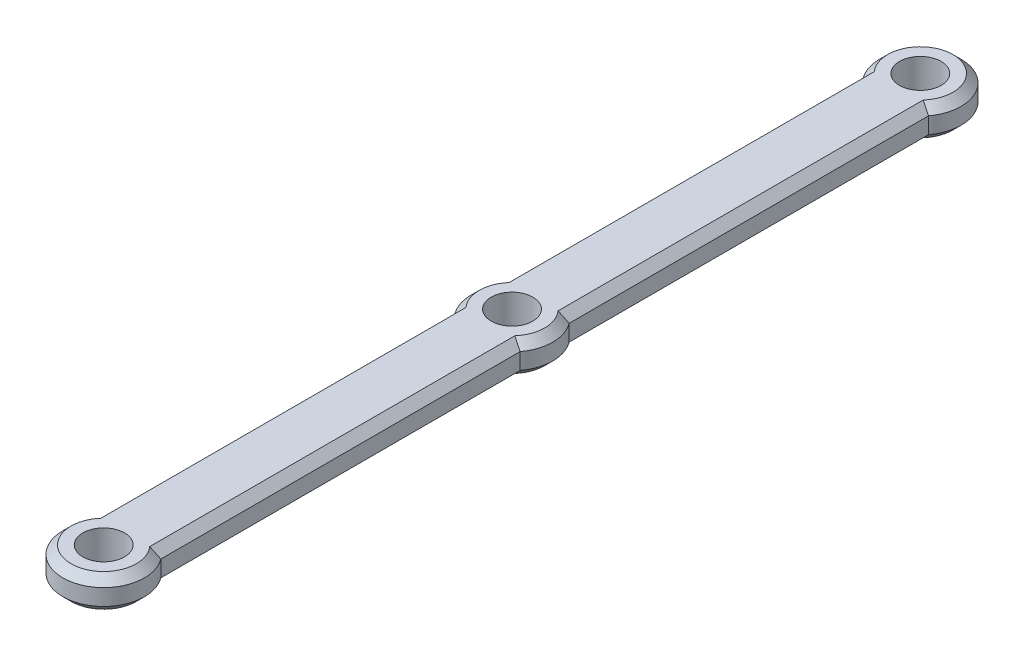
ISO-10303-21;
HEADER;
FILE_DESCRIPTION(('STEP AP214'),'2;1');
FILE_NAME('part.step','',(''),(''),'','','');
FILE_SCHEMA(('AUTOMOTIVE_DESIGN { 1 0 10303 214 1 1 1 1 }'));
ENDSEC;
DATA;
#1=APPLICATION_CONTEXT('core data for automotive mechanical design processes');
#2=APPLICATION_PROTOCOL_DEFINITION('international standard','automotive_design',2000,#1);
#3=PRODUCT_CONTEXT('',#1,'mechanical');
#4=PRODUCT('Part','Part','',(#3));
#5=PRODUCT_RELATED_PRODUCT_CATEGORY('part','',(#4));
#6=PRODUCT_DEFINITION_FORMATION('','',#4);
#7=PRODUCT_DEFINITION_CONTEXT('part definition',#1,'design');
#8=PRODUCT_DEFINITION('design','',#6,#7);
#9=PRODUCT_DEFINITION_SHAPE('','',#8);
#10=(LENGTH_UNIT() NAMED_UNIT(*) SI_UNIT(.MILLI.,.METRE.));
#11=(NAMED_UNIT(*) PLANE_ANGLE_UNIT() SI_UNIT($,.RADIAN.));
#12=(NAMED_UNIT(*) SI_UNIT($,.STERADIAN.) SOLID_ANGLE_UNIT());
#13=UNCERTAINTY_MEASURE_WITH_UNIT(LENGTH_MEASURE(1.E-05),#10,'distance_accuracy_value','');
#14=(GEOMETRIC_REPRESENTATION_CONTEXT(3) GLOBAL_UNCERTAINTY_ASSIGNED_CONTEXT((#13)) GLOBAL_UNIT_ASSIGNED_CONTEXT((#10,
#11,#12)) REPRESENTATION_CONTEXT('',''));
#15=CARTESIAN_POINT('',(0.,0.,0.));
#16=DIRECTION('',(0.,0.,1.));
#17=DIRECTION('',(1.,0.,0.));
#18=AXIS2_PLACEMENT_3D('',#15,#16,#17);
#19=CARTESIAN_POINT('',(0.,4.,0.));
#20=DIRECTION('',(0.,-1.,0.));
#21=DIRECTION('',(0.,0.,-1.));
#22=AXIS2_PLACEMENT_3D('',#19,#20,#21);
#23=CYLINDRICAL_SURFACE('',#22,5.);
#24=DIRECTION('',(0.,-1.,0.));
#25=VECTOR('',#24,1.);
#26=CARTESIAN_POINT('',(-4.,4.,-3.));
#27=LINE('',#26,#25);
#28=CARTESIAN_POINT('',(-4.,3.,-3.));
#29=VERTEX_POINT('',#28);
#30=CARTESIAN_POINT('',(-4.,0.999999999999987,-3.));
#31=VERTEX_POINT('',#30);
#32=EDGE_CURVE('E505',#29,#31,#27,.T.);
#33=ORIENTED_EDGE('',*,*,#32,.T.);
#34=CARTESIAN_POINT('',(0.,0.999999999999987,0.));
#35=DIRECTION('',(0.,1.,0.));
#36=DIRECTION('',(0.,0.,1.));
#37=AXIS2_PLACEMENT_3D('',#34,#35,#36);
#38=CIRCLE('',#37,5.);
#39=CARTESIAN_POINT('',(-4.,0.999999999999987,3.));
#40=VERTEX_POINT('',#39);
#41=EDGE_CURVE('E316',#31,#40,#38,.T.);
#42=ORIENTED_EDGE('',*,*,#41,.T.);
#43=DIRECTION('',(0.,-1.,0.));
#44=VECTOR('',#43,1.);
#45=CARTESIAN_POINT('',(-4.,4.,3.));
#46=LINE('',#45,#44);
#47=CARTESIAN_POINT('',(-4.,3.,3.));
#48=VERTEX_POINT('',#47);
#49=EDGE_CURVE('E193',#48,#40,#46,.T.);
#50=ORIENTED_EDGE('',*,*,#49,.F.);
#51=CARTESIAN_POINT('',(0.,3.,0.));
#52=DIRECTION('',(0.,1.,0.));
#53=DIRECTION('',(0.,0.,1.));
#54=AXIS2_PLACEMENT_3D('',#51,#52,#53);
#55=CIRCLE('',#54,5.);
#56=EDGE_CURVE('E310',#48,#29,#55,.F.);
#57=ORIENTED_EDGE('',*,*,#56,.T.);
#58=EDGE_LOOP('',(#33,#42,#50,#57));
#59=FACE_BOUND('',#58,.T.);
#60=ADVANCED_FACE('F41',(#59),#23,.T.);
#61=CARTESIAN_POINT('',(-4.,4.,3.));
#62=DIRECTION('',(1.,0.,0.));
#63=DIRECTION('',(0.,0.,-1.));
#64=AXIS2_PLACEMENT_3D('',#61,#62,#63);
#65=PLANE('',#64);
#66=ORIENTED_EDGE('',*,*,#49,.T.);
#67=DIRECTION('',(0.,0.,1.));
#68=VECTOR('',#67,1.);
#69=CARTESIAN_POINT('',(-4.,0.999999999999987,3.));
#70=LINE('',#69,#68);
#71=CARTESIAN_POINT('',(-4.00000000000001,0.999999999999987,47.));
#72=VERTEX_POINT('',#71);
#73=EDGE_CURVE('E307',#40,#72,#70,.T.);
#74=ORIENTED_EDGE('',*,*,#73,.T.);
#75=DIRECTION('',(0.,-1.,0.));
#76=VECTOR('',#75,1.);
#77=CARTESIAN_POINT('',(-4.00000000000001,4.,47.));
#78=LINE('',#77,#76);
#79=CARTESIAN_POINT('',(-4.00000000000001,3.,47.));
#80=VERTEX_POINT('',#79);
#81=EDGE_CURVE('E515',#80,#72,#78,.T.);
#82=ORIENTED_EDGE('',*,*,#81,.F.);
#83=DIRECTION('',(0.,0.,-1.));
#84=VECTOR('',#83,1.);
#85=CARTESIAN_POINT('',(-4.,3.,3.));
#86=LINE('',#85,#84);
#87=EDGE_CURVE('E301',#80,#48,#86,.T.);
#88=ORIENTED_EDGE('',*,*,#87,.T.);
#89=EDGE_LOOP('',(#66,#74,#82,#88));
#90=FACE_BOUND('',#89,.T.);
#91=ADVANCED_FACE('F440',(#90),#65,.F.);
#92=CARTESIAN_POINT('',(0.,4.,50.));
#93=DIRECTION('',(0.,-1.,0.));
#94=DIRECTION('',(0.,0.,-1.));
#95=AXIS2_PLACEMENT_3D('',#92,#93,#94);
#96=CYLINDRICAL_SURFACE('',#95,5.);
#97=ORIENTED_EDGE('',*,*,#81,.T.);
#98=CARTESIAN_POINT('',(0.,0.999999999999987,50.));
#99=DIRECTION('',(0.,1.,0.));
#100=DIRECTION('',(0.,0.,1.));
#101=AXIS2_PLACEMENT_3D('',#98,#99,#100);
#102=CIRCLE('',#101,5.);
#103=CARTESIAN_POINT('',(4.00000000000001,0.999999999999987,47.));
#104=VERTEX_POINT('',#103);
#105=EDGE_CURVE('E308',#72,#104,#102,.T.);
#106=ORIENTED_EDGE('',*,*,#105,.T.);
#107=DIRECTION('',(0.,-1.,0.));
#108=VECTOR('',#107,1.);
#109=CARTESIAN_POINT('',(4.00000000000001,4.,47.));
#110=LINE('',#109,#108);
#111=CARTESIAN_POINT('',(4.00000000000001,3.,47.));
#112=VERTEX_POINT('',#111);
#113=EDGE_CURVE('E512',#112,#104,#110,.T.);
#114=ORIENTED_EDGE('',*,*,#113,.F.);
#115=CARTESIAN_POINT('',(0.,3.,50.));
#116=DIRECTION('',(0.,1.,0.));
#117=DIRECTION('',(0.,0.,1.));
#118=AXIS2_PLACEMENT_3D('',#115,#116,#117);
#119=CIRCLE('',#118,5.);
#120=EDGE_CURVE('E295',#112,#80,#119,.F.);
#121=ORIENTED_EDGE('',*,*,#120,.T.);
#122=EDGE_LOOP('',(#97,#106,#114,#121));
#123=FACE_BOUND('',#122,.T.);
#124=ADVANCED_FACE('F445',(#123),#96,.T.);
#125=CARTESIAN_POINT('',(4.,4.,2.99999999999999));
#126=DIRECTION('',(-1.,0.,0.));
#127=DIRECTION('',(0.,0.,1.));
#128=AXIS2_PLACEMENT_3D('',#125,#126,#127);
#129=PLANE('',#128);
#130=ORIENTED_EDGE('',*,*,#113,.T.);
#131=DIRECTION('',(0.,0.,-1.));
#132=VECTOR('',#131,1.);
#133=CARTESIAN_POINT('',(4.,0.999999999999987,2.99999999999999));
#134=LINE('',#133,#132);
#135=CARTESIAN_POINT('',(4.,0.999999999999987,2.99999999999999));
#136=VERTEX_POINT('',#135);
#137=EDGE_CURVE('E539',#104,#136,#134,.T.);
#138=ORIENTED_EDGE('',*,*,#137,.T.);
#139=DIRECTION('',(0.,-1.,0.));
#140=VECTOR('',#139,1.);
#141=CARTESIAN_POINT('',(4.,4.,2.99999999999999));
#142=LINE('',#141,#140);
#143=CARTESIAN_POINT('',(4.,3.,2.99999999999999));
#144=VERTEX_POINT('',#143);
#145=EDGE_CURVE('E184',#144,#136,#142,.T.);
#146=ORIENTED_EDGE('',*,*,#145,.F.);
#147=DIRECTION('',(0.,0.,1.));
#148=VECTOR('',#147,1.);
#149=CARTESIAN_POINT('',(4.00000000000001,3.,47.));
#150=LINE('',#149,#148);
#151=EDGE_CURVE('E537',#144,#112,#150,.T.);
#152=ORIENTED_EDGE('',*,*,#151,.T.);
#153=EDGE_LOOP('',(#130,#138,#146,#152));
#154=FACE_BOUND('',#153,.T.);
#155=ADVANCED_FACE('F451',(#154),#129,.F.);
#156=CARTESIAN_POINT('',(0.,4.,0.));
#157=DIRECTION('',(0.,-1.,0.));
#158=DIRECTION('',(0.,0.,-1.));
#159=AXIS2_PLACEMENT_3D('',#156,#157,#158);
#160=CYLINDRICAL_SURFACE('',#159,5.);
#161=ORIENTED_EDGE('',*,*,#145,.T.);
#162=CARTESIAN_POINT('',(0.,0.999999999999987,0.));
#163=DIRECTION('',(0.,1.,0.));
#164=DIRECTION('',(0.,0.,1.));
#165=AXIS2_PLACEMENT_3D('',#162,#163,#164);
#166=CIRCLE('',#165,5.);
#167=CARTESIAN_POINT('',(4.,0.999999999999987,-2.99999999999999));
#168=VERTEX_POINT('',#167);
#169=EDGE_CURVE('E183',#136,#168,#166,.T.);
#170=ORIENTED_EDGE('',*,*,#169,.T.);
#171=DIRECTION('',(0.,-1.,0.));
#172=VECTOR('',#171,1.);
#173=CARTESIAN_POINT('',(4.,4.,-2.99999999999999));
#174=LINE('',#173,#172);
#175=CARTESIAN_POINT('',(4.,3.,-2.99999999999999));
#176=VERTEX_POINT('',#175);
#177=EDGE_CURVE('E164',#176,#168,#174,.T.);
#178=ORIENTED_EDGE('',*,*,#177,.F.);
#179=CARTESIAN_POINT('',(0.,3.,0.));
#180=DIRECTION('',(0.,1.,0.));
#181=DIRECTION('',(0.,0.,1.));
#182=AXIS2_PLACEMENT_3D('',#179,#180,#181);
#183=CIRCLE('',#182,5.);
#184=EDGE_CURVE('E180',#176,#144,#183,.F.);
#185=ORIENTED_EDGE('',*,*,#184,.T.);
#186=EDGE_LOOP('',(#161,#170,#178,#185));
#187=FACE_BOUND('',#186,.T.);
#188=ADVANCED_FACE('F179',(#187),#160,.T.);
#189=CARTESIAN_POINT('',(4.,4.,-47.));
#190=DIRECTION('',(-1.,0.,0.));
#191=DIRECTION('',(0.,0.,1.));
#192=AXIS2_PLACEMENT_3D('',#189,#190,#191);
#193=PLANE('',#192);
#194=ORIENTED_EDGE('',*,*,#177,.T.);
#195=DIRECTION('',(0.,0.,-1.));
#196=VECTOR('',#195,1.);
#197=CARTESIAN_POINT('',(4.,0.999999999999987,-47.));
#198=LINE('',#197,#196);
#199=CARTESIAN_POINT('',(3.99999999999998,0.999999999999987,-47.));
#200=VERTEX_POINT('',#199);
#201=EDGE_CURVE('E171',#168,#200,#198,.T.);
#202=ORIENTED_EDGE('',*,*,#201,.T.);
#203=DIRECTION('',(0.,-1.,0.));
#204=VECTOR('',#203,1.);
#205=CARTESIAN_POINT('',(3.99999999999998,4.,-47.));
#206=LINE('',#205,#204);
#207=CARTESIAN_POINT('',(3.99999999999998,3.,-47.));
#208=VERTEX_POINT('',#207);
#209=EDGE_CURVE('E166',#208,#200,#206,.T.);
#210=ORIENTED_EDGE('',*,*,#209,.F.);
#211=DIRECTION('',(0.,0.,1.));
#212=VECTOR('',#211,1.);
#213=CARTESIAN_POINT('',(4.,3.,-2.99999999999999));
#214=LINE('',#213,#212);
#215=EDGE_CURVE('E161',#208,#176,#214,.T.);
#216=ORIENTED_EDGE('',*,*,#215,.T.);
#217=EDGE_LOOP('',(#194,#202,#210,#216));
#218=FACE_BOUND('',#217,.T.);
#219=ADVANCED_FACE('F163',(#218),#193,.F.);
#220=CARTESIAN_POINT('',(0.,4.,-50.));
#221=DIRECTION('',(0.,-1.,0.));
#222=DIRECTION('',(0.,0.,-1.));
#223=AXIS2_PLACEMENT_3D('',#220,#221,#222);
#224=CYLINDRICAL_SURFACE('',#223,5.00000000000002);
#225=ORIENTED_EDGE('',*,*,#209,.T.);
#226=CARTESIAN_POINT('',(0.,0.999999999999987,-50.));
#227=DIRECTION('',(0.,1.,0.));
#228=DIRECTION('',(0.,0.,1.));
#229=AXIS2_PLACEMENT_3D('',#226,#227,#228);
#230=CIRCLE('',#229,5.00000000000002);
#231=CARTESIAN_POINT('',(-4.,0.999999999999987,-47.));
#232=VERTEX_POINT('',#231);
#233=EDGE_CURVE('E172',#200,#232,#230,.T.);
#234=ORIENTED_EDGE('',*,*,#233,.T.);
#235=DIRECTION('',(0.,-1.,0.));
#236=VECTOR('',#235,1.);
#237=CARTESIAN_POINT('',(-4.,4.,-47.));
#238=LINE('',#237,#236);
#239=CARTESIAN_POINT('',(-4.,3.,-47.));
#240=VERTEX_POINT('',#239);
#241=EDGE_CURVE('E507',#240,#232,#238,.T.);
#242=ORIENTED_EDGE('',*,*,#241,.F.);
#243=CARTESIAN_POINT('',(0.,3.,-50.));
#244=DIRECTION('',(0.,1.,0.));
#245=DIRECTION('',(0.,0.,1.));
#246=AXIS2_PLACEMENT_3D('',#243,#244,#245);
#247=CIRCLE('',#246,5.00000000000002);
#248=EDGE_CURVE('E322',#240,#208,#247,.F.);
#249=ORIENTED_EDGE('',*,*,#248,.T.);
#250=EDGE_LOOP('',(#225,#234,#242,#249));
#251=FACE_BOUND('',#250,.T.);
#252=ADVANCED_FACE('F460',(#251),#224,.T.);
#253=CARTESIAN_POINT('',(-4.,4.,-47.));
#254=DIRECTION('',(1.,0.,0.));
#255=DIRECTION('',(0.,0.,-1.));
#256=AXIS2_PLACEMENT_3D('',#253,#254,#255);
#257=PLANE('',#256);
#258=ORIENTED_EDGE('',*,*,#241,.T.);
#259=DIRECTION('',(0.,0.,1.));
#260=VECTOR('',#259,1.);
#261=CARTESIAN_POINT('',(-4.,0.999999999999987,-47.));
#262=LINE('',#261,#260);
#263=EDGE_CURVE('E320',#232,#31,#262,.T.);
#264=ORIENTED_EDGE('',*,*,#263,.T.);
#265=ORIENTED_EDGE('',*,*,#32,.F.);
#266=DIRECTION('',(0.,0.,-1.));
#267=VECTOR('',#266,1.);
#268=CARTESIAN_POINT('',(-4.,3.,-47.));
#269=LINE('',#268,#267);
#270=EDGE_CURVE('E318',#29,#240,#269,.T.);
#271=ORIENTED_EDGE('',*,*,#270,.T.);
#272=EDGE_LOOP('',(#258,#264,#265,#271));
#273=FACE_BOUND('',#272,.T.);
#274=ADVANCED_FACE('F463',(#273),#257,.F.);
#275=CARTESIAN_POINT('',(0.,4.,0.));
#276=DIRECTION('',(0.,1.,0.));
#277=DIRECTION('',(0.,0.,1.));
#278=AXIS2_PLACEMENT_3D('',#275,#276,#277);
#279=PLANE('',#278);
#280=DIRECTION('',(0.,0.,-1.));
#281=VECTOR('',#280,1.);
#282=CARTESIAN_POINT('',(3.00000000000002,4.,2.99999999999999));
#283=LINE('',#282,#281);
#284=CARTESIAN_POINT('',(3.00000000000002,4.,47.3542486889354));
#285=VERTEX_POINT('',#284);
#286=CARTESIAN_POINT('',(3.00000000000002,4.,2.64575131106458));
#287=VERTEX_POINT('',#286);
#288=EDGE_CURVE('E56',#285,#287,#283,.T.);
#289=ORIENTED_EDGE('',*,*,#288,.T.);
#290=CARTESIAN_POINT('',(0.,4.,0.));
#291=DIRECTION('',(0.,1.,0.));
#292=DIRECTION('',(0.,0.,1.));
#293=AXIS2_PLACEMENT_3D('',#290,#291,#292);
#294=CIRCLE('',#293,4.00000000000001);
#295=CARTESIAN_POINT('',(3.00000000000002,4.,-2.64575131106458));
#296=VERTEX_POINT('',#295);
#297=EDGE_CURVE('E11',#287,#296,#294,.T.);
#298=ORIENTED_EDGE('',*,*,#297,.T.);
#299=DIRECTION('',(0.,0.,-1.));
#300=VECTOR('',#299,1.);
#301=CARTESIAN_POINT('',(3.00000000000001,4.,-47.));
#302=LINE('',#301,#300);
#303=CARTESIAN_POINT('',(3.00000000000001,4.,-47.3542486889354));
#304=VERTEX_POINT('',#303);
#305=EDGE_CURVE('E196',#296,#304,#302,.T.);
#306=ORIENTED_EDGE('',*,*,#305,.T.);
#307=CARTESIAN_POINT('',(0.,4.,-50.));
#308=DIRECTION('',(0.,1.,0.));
#309=DIRECTION('',(0.,0.,1.));
#310=AXIS2_PLACEMENT_3D('',#307,#308,#309);
#311=CIRCLE('',#310,4.00000000000003);
#312=CARTESIAN_POINT('',(-3.00000000000001,4.,-47.3542486889354));
#313=VERTEX_POINT('',#312);
#314=EDGE_CURVE('E327',#304,#313,#311,.T.);
#315=ORIENTED_EDGE('',*,*,#314,.T.);
#316=DIRECTION('',(0.,0.,1.));
#317=VECTOR('',#316,1.);
#318=CARTESIAN_POINT('',(-3.00000000000002,4.,-3.));
#319=LINE('',#318,#317);
#320=CARTESIAN_POINT('',(-3.00000000000002,4.,-2.6457513110646));
#321=VERTEX_POINT('',#320);
#322=EDGE_CURVE('E329',#313,#321,#319,.T.);
#323=ORIENTED_EDGE('',*,*,#322,.T.);
#324=CARTESIAN_POINT('',(0.,4.,0.));
#325=DIRECTION('',(0.,1.,0.));
#326=DIRECTION('',(0.,0.,1.));
#327=AXIS2_PLACEMENT_3D('',#324,#325,#326);
#328=CIRCLE('',#327,4.00000000000001);
#329=CARTESIAN_POINT('',(-3.00000000000002,4.,2.6457513110646));
#330=VERTEX_POINT('',#329);
#331=EDGE_CURVE('E331',#321,#330,#328,.T.);
#332=ORIENTED_EDGE('',*,*,#331,.T.);
#333=DIRECTION('',(0.,0.,1.));
#334=VECTOR('',#333,1.);
#335=CARTESIAN_POINT('',(-3.00000000000002,4.,47.));
#336=LINE('',#335,#334);
#337=CARTESIAN_POINT('',(-3.00000000000002,4.,47.3542486889354));
#338=VERTEX_POINT('',#337);
#339=EDGE_CURVE('E300',#330,#338,#336,.T.);
#340=ORIENTED_EDGE('',*,*,#339,.T.);
#341=CARTESIAN_POINT('',(0.,4.,50.));
#342=DIRECTION('',(0.,1.,0.));
#343=DIRECTION('',(0.,0.,1.));
#344=AXIS2_PLACEMENT_3D('',#341,#342,#343);
#345=CIRCLE('',#344,4.00000000000001);
#346=EDGE_CURVE('E67',#338,#285,#345,.T.);
#347=ORIENTED_EDGE('',*,*,#346,.T.);
#348=EDGE_LOOP('',(#289,#298,#306,#315,#323,#332,#340,#347));
#349=FACE_BOUND('',#348,.T.);
#350=CARTESIAN_POINT('',(0.,4.,-50.));
#351=DIRECTION('',(0.,1.,0.));
#352=DIRECTION('',(0.,0.,1.));
#353=AXIS2_PLACEMENT_3D('',#350,#351,#352);
#354=CIRCLE('',#353,2.55);
#355=CARTESIAN_POINT('',(0.,4.,-47.45));
#356=VERTEX_POINT('',#355);
#357=EDGE_CURVE('E491',#356,#356,#354,.T.);
#358=ORIENTED_EDGE('',*,*,#357,.F.);
#359=EDGE_LOOP('',(#358));
#360=FACE_BOUND('',#359,.T.);
#361=CARTESIAN_POINT('',(0.,4.,50.));
#362=DIRECTION('',(0.,1.,0.));
#363=DIRECTION('',(0.,0.,-1.));
#364=AXIS2_PLACEMENT_3D('',#361,#362,#363);
#365=CIRCLE('',#364,2.55);
#366=CARTESIAN_POINT('',(0.,4.,47.45));
#367=VERTEX_POINT('',#366);
#368=EDGE_CURVE('E489',#367,#367,#365,.T.);
#369=ORIENTED_EDGE('',*,*,#368,.F.);
#370=EDGE_LOOP('',(#369));
#371=FACE_BOUND('',#370,.T.);
#372=CARTESIAN_POINT('',(0.,4.,0.));
#373=DIRECTION('',(0.,1.,0.));
#374=DIRECTION('',(0.,0.,1.));
#375=AXIS2_PLACEMENT_3D('',#372,#373,#374);
#376=CIRCLE('',#375,2.55);
#377=CARTESIAN_POINT('',(0.,4.,2.55));
#378=VERTEX_POINT('',#377);
#379=EDGE_CURVE('E496',#378,#378,#376,.T.);
#380=ORIENTED_EDGE('',*,*,#379,.F.);
#381=EDGE_LOOP('',(#380));
#382=FACE_BOUND('',#381,.T.);
#383=ADVANCED_FACE('F467',(#349,#360,#371,#382),#279,.T.);
#384=CARTESIAN_POINT('',(0.,0.,0.));
#385=DIRECTION('',(0.,1.,0.));
#386=DIRECTION('',(0.,0.,1.));
#387=AXIS2_PLACEMENT_3D('',#384,#385,#386);
#388=PLANE('',#387);
#389=DIRECTION('',(0.,0.,1.));
#390=VECTOR('',#389,1.);
#391=CARTESIAN_POINT('',(3.,0.,0.));
#392=LINE('',#391,#390);
#393=CARTESIAN_POINT('',(3.,0.,-47.3542486889354));
#394=VERTEX_POINT('',#393);
#395=CARTESIAN_POINT('',(3.,0.,-2.64575131106458));
#396=VERTEX_POINT('',#395);
#397=EDGE_CURVE('E520',#394,#396,#392,.T.);
#398=ORIENTED_EDGE('',*,*,#397,.T.);
#399=CARTESIAN_POINT('',(0.,0.,0.));
#400=DIRECTION('',(0.,1.,0.));
#401=DIRECTION('',(0.,0.,1.));
#402=AXIS2_PLACEMENT_3D('',#399,#400,#401);
#403=CIRCLE('',#402,4.);
#404=CARTESIAN_POINT('',(3.,0.,2.64575131106458));
#405=VERTEX_POINT('',#404);
#406=EDGE_CURVE('E534',#396,#405,#403,.F.);
#407=ORIENTED_EDGE('',*,*,#406,.T.);
#408=DIRECTION('',(0.,0.,1.));
#409=VECTOR('',#408,1.);
#410=CARTESIAN_POINT('',(3.,0.,0.));
#411=LINE('',#410,#409);
#412=CARTESIAN_POINT('',(3.00000000000001,0.,47.3542486889354));
#413=VERTEX_POINT('',#412);
#414=EDGE_CURVE('E532',#405,#413,#411,.T.);
#415=ORIENTED_EDGE('',*,*,#414,.T.);
#416=CARTESIAN_POINT('',(0.,0.,50.));
#417=DIRECTION('',(0.,1.,0.));
#418=DIRECTION('',(0.,0.,1.));
#419=AXIS2_PLACEMENT_3D('',#416,#417,#418);
#420=CIRCLE('',#419,4.);
#421=CARTESIAN_POINT('',(-3.00000000000001,0.,47.3542486889354));
#422=VERTEX_POINT('',#421);
#423=EDGE_CURVE('E530',#413,#422,#420,.F.);
#424=ORIENTED_EDGE('',*,*,#423,.T.);
#425=DIRECTION('',(0.,0.,-1.));
#426=VECTOR('',#425,1.);
#427=CARTESIAN_POINT('',(-3.,0.,0.));
#428=LINE('',#427,#426);
#429=CARTESIAN_POINT('',(-3.,0.,2.64575131106459));
#430=VERTEX_POINT('',#429);
#431=EDGE_CURVE('E528',#422,#430,#428,.T.);
#432=ORIENTED_EDGE('',*,*,#431,.T.);
#433=CARTESIAN_POINT('',(0.,0.,0.));
#434=DIRECTION('',(0.,1.,0.));
#435=DIRECTION('',(0.,0.,1.));
#436=AXIS2_PLACEMENT_3D('',#433,#434,#435);
#437=CIRCLE('',#436,4.);
#438=CARTESIAN_POINT('',(-3.,0.,-2.64575131106459));
#439=VERTEX_POINT('',#438);
#440=EDGE_CURVE('E526',#430,#439,#437,.F.);
#441=ORIENTED_EDGE('',*,*,#440,.T.);
#442=DIRECTION('',(0.,0.,-1.));
#443=VECTOR('',#442,1.);
#444=CARTESIAN_POINT('',(-3.,0.,0.));
#445=LINE('',#444,#443);
#446=CARTESIAN_POINT('',(-3.,0.,-47.3542486889354));
#447=VERTEX_POINT('',#446);
#448=EDGE_CURVE('E524',#439,#447,#445,.T.);
#449=ORIENTED_EDGE('',*,*,#448,.T.);
#450=CARTESIAN_POINT('',(0.,0.,-50.));
#451=DIRECTION('',(0.,1.,0.));
#452=DIRECTION('',(0.,0.,1.));
#453=AXIS2_PLACEMENT_3D('',#450,#451,#452);
#454=CIRCLE('',#453,4.00000000000002);
#455=EDGE_CURVE('E522',#447,#394,#454,.F.);
#456=ORIENTED_EDGE('',*,*,#455,.T.);
#457=EDGE_LOOP('',(#398,#407,#415,#424,#432,#441,#449,#456));
#458=FACE_BOUND('',#457,.T.);
#459=CARTESIAN_POINT('',(0.,0.,-50.));
#460=DIRECTION('',(0.,1.,0.));
#461=DIRECTION('',(0.,0.,1.));
#462=AXIS2_PLACEMENT_3D('',#459,#460,#461);
#463=CIRCLE('',#462,2.55);
#464=CARTESIAN_POINT('',(0.,0.,-47.45));
#465=VERTEX_POINT('',#464);
#466=EDGE_CURVE('E494',#465,#465,#463,.T.);
#467=ORIENTED_EDGE('',*,*,#466,.T.);
#468=EDGE_LOOP('',(#467));
#469=FACE_BOUND('',#468,.T.);
#470=CARTESIAN_POINT('',(0.,0.,50.));
#471=DIRECTION('',(0.,1.,0.));
#472=DIRECTION('',(0.,0.,-1.));
#473=AXIS2_PLACEMENT_3D('',#470,#471,#472);
#474=CIRCLE('',#473,2.55);
#475=CARTESIAN_POINT('',(0.,0.,47.45));
#476=VERTEX_POINT('',#475);
#477=EDGE_CURVE('E486',#476,#476,#474,.T.);
#478=ORIENTED_EDGE('',*,*,#477,.T.);
#479=EDGE_LOOP('',(#478));
#480=FACE_BOUND('',#479,.T.);
#481=CARTESIAN_POINT('',(0.,0.,0.));
#482=DIRECTION('',(0.,1.,0.));
#483=DIRECTION('',(0.,0.,1.));
#484=AXIS2_PLACEMENT_3D('',#481,#482,#483);
#485=CIRCLE('',#484,2.55);
#486=CARTESIAN_POINT('',(0.,0.,2.55));
#487=VERTEX_POINT('',#486);
#488=EDGE_CURVE('E502',#487,#487,#485,.T.);
#489=ORIENTED_EDGE('',*,*,#488,.T.);
#490=EDGE_LOOP('',(#489));
#491=FACE_BOUND('',#490,.T.);
#492=ADVANCED_FACE('F469',(#458,#469,#480,#491),#388,.F.);
#493=CARTESIAN_POINT('',(0.,0.,0.));
#494=DIRECTION('',(0.,1.,0.));
#495=DIRECTION('',(0.,0.,1.));
#496=AXIS2_PLACEMENT_3D('',#493,#494,#495);
#497=CYLINDRICAL_SURFACE('',#496,2.55);
#498=ORIENTED_EDGE('',*,*,#488,.F.);
#499=EDGE_LOOP('',(#498));
#500=FACE_BOUND('',#499,.T.);
#501=ORIENTED_EDGE('',*,*,#379,.T.);
#502=EDGE_LOOP('',(#501));
#503=FACE_BOUND('',#502,.T.);
#504=ADVANCED_FACE('F472',(#500,#503),#497,.F.);
#505=CARTESIAN_POINT('',(0.,0.,50.));
#506=DIRECTION('',(0.,1.,0.));
#507=DIRECTION('',(0.,0.,1.));
#508=AXIS2_PLACEMENT_3D('',#505,#506,#507);
#509=CYLINDRICAL_SURFACE('',#508,2.55);
#510=ORIENTED_EDGE('',*,*,#477,.F.);
#511=EDGE_LOOP('',(#510));
#512=FACE_BOUND('',#511,.T.);
#513=ORIENTED_EDGE('',*,*,#368,.T.);
#514=EDGE_LOOP('',(#513));
#515=FACE_BOUND('',#514,.T.);
#516=ADVANCED_FACE('F435',(#512,#515),#509,.F.);
#517=CARTESIAN_POINT('',(0.,0.,-50.));
#518=DIRECTION('',(0.,1.,0.));
#519=DIRECTION('',(0.,0.,1.));
#520=AXIS2_PLACEMENT_3D('',#517,#518,#519);
#521=CYLINDRICAL_SURFACE('',#520,2.55);
#522=ORIENTED_EDGE('',*,*,#466,.F.);
#523=EDGE_LOOP('',(#522));
#524=FACE_BOUND('',#523,.T.);
#525=ORIENTED_EDGE('',*,*,#357,.T.);
#526=EDGE_LOOP('',(#525));
#527=FACE_BOUND('',#526,.T.);
#528=ADVANCED_FACE('F427',(#524,#527),#521,.F.);
#529=CARTESIAN_POINT('',(0.,0.999999999999987,0.));
#530=DIRECTION('',(0.,1.,0.));
#531=DIRECTION('',(0.,0.,1.));
#532=AXIS2_PLACEMENT_3D('',#529,#530,#531);
#533=CONICAL_SURFACE('',#532,5.,0.785398163397455);
#534=CARTESIAN_POINT('',(-3.,0.,-2.64575131106459));
#535=CARTESIAN_POINT('',(-3.08300167213387,0.0830016721338683,-2.67712048273938));
#536=CARTESIAN_POINT('',(-3.1661003246299,0.166100324629894,-2.70797343392842));
#537=CARTESIAN_POINT('',(-3.33246643308927,0.332466433089264,-2.76872877407169));
#538=CARTESIAN_POINT('',(-3.41573387957519,0.415733879575187,-2.79863121490397));
#539=CARTESIAN_POINT('',(-3.58242028599778,0.58242028599777,-2.85757039592516));
#540=CARTESIAN_POINT('',(-3.66583924371128,0.665839243711267,-2.88660714870938));
#541=CARTESIAN_POINT('',(-3.83281861588638,0.832818615886365,-2.94388438100065));
#542=CARTESIAN_POINT('',(-3.91637903782788,0.916379037827867,-2.97212481691412));
#543=CARTESIAN_POINT('',(-4.,0.999999999999987,-3.));
#544=B_SPLINE_CURVE_WITH_KNOTS('',3,(#534,#535,#536,#537,#538,#539,#540,#541,#542,#543),
.UNSPECIFIED.,.F.,.F.,(4,2,2,2,4),(0.,0.364501781748578,0.728983635016975,1.09346018267244,
1.45795664465115),.UNSPECIFIED.);
#545=EDGE_CURVE('E415',#439,#31,#544,.T.);
#546=ORIENTED_EDGE('',*,*,#545,.F.);
#547=ORIENTED_EDGE('',*,*,#440,.F.);
#548=CARTESIAN_POINT('',(-3.,0.,2.64575131106459));
#549=CARTESIAN_POINT('',(-3.08300167213387,0.083001672133868,2.67712048273938));
#550=CARTESIAN_POINT('',(-3.1661003246299,0.166100324629894,2.70797343392842));
#551=CARTESIAN_POINT('',(-3.33246643308927,0.332466433089264,2.76872877407169));
#552=CARTESIAN_POINT('',(-3.4157338795752,0.415733879575187,2.79863121490397));
#553=CARTESIAN_POINT('',(-3.58242028599778,0.58242028599777,2.85757039592516));
#554=CARTESIAN_POINT('',(-3.66583924371128,0.665839243711267,2.88660714870938));
#555=CARTESIAN_POINT('',(-3.83281861588638,0.832818615886366,2.94388438100065));
#556=CARTESIAN_POINT('',(-3.91637903782788,0.916379037827868,2.97212481691412));
#557=CARTESIAN_POINT('',(-4.,0.999999999999987,3.));
#558=B_SPLINE_CURVE_WITH_KNOTS('',3,(#548,#549,#550,#551,#552,#553,#554,#555,#556,#557),
.UNSPECIFIED.,.F.,.F.,(4,2,2,2,4),(0.,0.364501781748578,0.728983635016975,1.09346018267244,
1.45795664465115),.UNSPECIFIED.);
#559=EDGE_CURVE('E207',#40,#430,#558,.F.);
#560=ORIENTED_EDGE('',*,*,#559,.F.);
#561=ORIENTED_EDGE('',*,*,#41,.F.);
#562=EDGE_LOOP('',(#546,#547,#560,#561));
#563=FACE_BOUND('',#562,.T.);
#564=ADVANCED_FACE('F422',(#563),#533,.T.);
#565=CARTESIAN_POINT('',(-4.,0.999999999999987,3.));
#566=DIRECTION('',(0.707106781186543,0.707106781186552,0.));
#567=DIRECTION('',(0.,0.,1.));
#568=AXIS2_PLACEMENT_3D('',#565,#566,#567);
#569=PLANE('',#568);
#570=ORIENTED_EDGE('',*,*,#559,.T.);
#571=ORIENTED_EDGE('',*,*,#431,.F.);
#572=CARTESIAN_POINT('',(-3.00000000000001,0.,47.3542486889354));
#573=CARTESIAN_POINT('',(-3.08300167213388,0.0830016721338682,47.3228795172606));
#574=CARTESIAN_POINT('',(-3.16610032462991,0.166100324629894,47.2920265660716));
#575=CARTESIAN_POINT('',(-3.33246643308928,0.332466433089264,47.2312712259283));
#576=CARTESIAN_POINT('',(-3.4157338795752,0.415733879575186,47.2013687850961));
#577=CARTESIAN_POINT('',(-3.58242028599779,0.58242028599777,47.1424296040749));
#578=CARTESIAN_POINT('',(-3.66583924371129,0.665839243711267,47.1133928512906));
#579=CARTESIAN_POINT('',(-3.83281861588639,0.832818615886366,47.0561156189994));
#580=CARTESIAN_POINT('',(-3.91637903782789,0.916379037827867,47.0278751830859));
#581=CARTESIAN_POINT('',(-4.00000000000001,0.999999999999986,47.));
#582=B_SPLINE_CURVE_WITH_KNOTS('',3,(#572,#573,#574,#575,#576,#577,#578,#579,#580,#581),
.UNSPECIFIED.,.F.,.F.,(4,2,2,2,4),(0.,0.364501781748577,0.728983635016973,1.09346018267244,
1.45795664465115),.UNSPECIFIED.);
#583=EDGE_CURVE('E399',#72,#422,#582,.F.);
#584=ORIENTED_EDGE('',*,*,#583,.F.);
#585=ORIENTED_EDGE('',*,*,#73,.F.);
#586=EDGE_LOOP('',(#570,#571,#584,#585));
#587=FACE_BOUND('',#586,.T.);
#588=ADVANCED_FACE('F411',(#587),#569,.F.);
#589=CARTESIAN_POINT('',(-4.,0.999999999999987,-47.));
#590=DIRECTION('',(0.707106781186543,0.707106781186552,0.));
#591=DIRECTION('',(0.,0.,1.));
#592=AXIS2_PLACEMENT_3D('',#589,#590,#591);
#593=PLANE('',#592);
#594=ORIENTED_EDGE('',*,*,#545,.T.);
#595=ORIENTED_EDGE('',*,*,#263,.F.);
#596=CARTESIAN_POINT('',(-3.,0.,-47.3542486889354));
#597=CARTESIAN_POINT('',(-3.08300167213387,0.0830016721338675,-47.3228795172606));
#598=CARTESIAN_POINT('',(-3.16610032462989,0.166100324629893,-47.2920265660715));
#599=CARTESIAN_POINT('',(-3.33246643308926,0.332466433089262,-47.2312712259283));
#600=CARTESIAN_POINT('',(-3.41573387957519,0.415733879575184,-47.201368785096));
#601=CARTESIAN_POINT('',(-3.58242028599777,0.582420285997767,-47.1424296040748));
#602=CARTESIAN_POINT('',(-3.66583924371127,0.665839243711264,-47.1133928512906));
#603=CARTESIAN_POINT('',(-3.83281861588637,0.832818615886362,-47.0561156189993));
#604=CARTESIAN_POINT('',(-3.91637903782787,0.916379037827863,-47.0278751830858));
#605=CARTESIAN_POINT('',(-3.99999999999999,0.999999999999982,-47.));
#606=B_SPLINE_CURVE_WITH_KNOTS('',3,(#596,#597,#598,#599,#600,#601,#602,#603,#604,#605),
.UNSPECIFIED.,.F.,.F.,(4,2,2,2,4),(0.,0.364501781748575,0.728983635016971,1.09346018267244,
1.45795664465114),.UNSPECIFIED.);
#607=EDGE_CURVE('E392',#447,#232,#606,.T.);
#608=ORIENTED_EDGE('',*,*,#607,.F.);
#609=ORIENTED_EDGE('',*,*,#448,.F.);
#610=EDGE_LOOP('',(#594,#595,#608,#609));
#611=FACE_BOUND('',#610,.T.);
#612=ADVANCED_FACE('F405',(#611),#593,.F.);
#613=CARTESIAN_POINT('',(0.,0.999999999999987,50.));
#614=DIRECTION('',(0.,1.,0.));
#615=DIRECTION('',(0.,0.,1.));
#616=AXIS2_PLACEMENT_3D('',#613,#614,#615);
#617=CONICAL_SURFACE('',#616,5.,0.785398163397456);
#618=ORIENTED_EDGE('',*,*,#583,.T.);
#619=ORIENTED_EDGE('',*,*,#423,.F.);
#620=CARTESIAN_POINT('',(3.00000000000001,0.,47.3542486889354));
#621=CARTESIAN_POINT('',(3.08300167213388,0.0830016721338676,47.3228795172606));
#622=CARTESIAN_POINT('',(3.16610032462991,0.166100324629893,47.2920265660716));
#623=CARTESIAN_POINT('',(3.33246643308928,0.332466433089263,47.2312712259283));
#624=CARTESIAN_POINT('',(3.4157338795752,0.415733879575186,47.2013687850961));
#625=CARTESIAN_POINT('',(3.58242028599779,0.58242028599777,47.1424296040749));
#626=CARTESIAN_POINT('',(3.66583924371129,0.665839243711267,47.1133928512906));
#627=CARTESIAN_POINT('',(3.83281861588639,0.832818615886366,47.0561156189994));
#628=CARTESIAN_POINT('',(3.91637903782789,0.916379037827868,47.0278751830859));
#629=CARTESIAN_POINT('',(4.00000000000001,0.999999999999987,47.));
#630=B_SPLINE_CURVE_WITH_KNOTS('',3,(#620,#621,#622,#623,#624,#625,#626,#627,#628,#629),
.UNSPECIFIED.,.F.,.F.,(4,2,2,2,4),(0.,0.364501781748577,0.728983635016974,1.09346018267245,
1.45795664465115),.UNSPECIFIED.);
#631=EDGE_CURVE('E373',#104,#413,#630,.F.);
#632=ORIENTED_EDGE('',*,*,#631,.F.);
#633=ORIENTED_EDGE('',*,*,#105,.F.);
#634=EDGE_LOOP('',(#618,#619,#632,#633));
#635=FACE_BOUND('',#634,.T.);
#636=ADVANCED_FACE('F387',(#635),#617,.T.);
#637=CARTESIAN_POINT('',(0.,0.999999999999987,-50.));
#638=DIRECTION('',(0.,1.,0.));
#639=DIRECTION('',(0.,0.,1.));
#640=AXIS2_PLACEMENT_3D('',#637,#638,#639);
#641=CONICAL_SURFACE('',#640,5.00000000000002,0.785398163397454);
#642=ORIENTED_EDGE('',*,*,#607,.T.);
#643=ORIENTED_EDGE('',*,*,#233,.F.);
#644=CARTESIAN_POINT('',(3.,0.,-47.3542486889354));
#645=CARTESIAN_POINT('',(3.08300167213387,0.0830016721338676,-47.3228795172606));
#646=CARTESIAN_POINT('',(3.16610032462989,0.166100324629893,-47.2920265660716));
#647=CARTESIAN_POINT('',(3.33246643308926,0.332466433089262,-47.2312712259283));
#648=CARTESIAN_POINT('',(3.41573387957519,0.415733879575184,-47.201368785096));
#649=CARTESIAN_POINT('',(3.58242028599777,0.582420285997767,-47.1424296040748));
#650=CARTESIAN_POINT('',(3.66583924371127,0.665839243711264,-47.1133928512906));
#651=CARTESIAN_POINT('',(3.83281861588637,0.832818615886363,-47.0561156189994));
#652=CARTESIAN_POINT('',(3.91637903782787,0.916379037827865,-47.0278751830859));
#653=CARTESIAN_POINT('',(3.99999999999999,0.999999999999983,-47.));
#654=B_SPLINE_CURVE_WITH_KNOTS('',3,(#644,#645,#646,#647,#648,#649,#650,#651,#652,#653),
.UNSPECIFIED.,.F.,.F.,(4,2,2,2,4),(0.,0.364501781748576,0.728983635016971,1.09346018267244,
1.45795664465114),.UNSPECIFIED.);
#655=EDGE_CURVE('E366',#394,#200,#654,.T.);
#656=ORIENTED_EDGE('',*,*,#655,.F.);
#657=ORIENTED_EDGE('',*,*,#455,.F.);
#658=EDGE_LOOP('',(#642,#643,#656,#657));
#659=FACE_BOUND('',#658,.T.);
#660=ADVANCED_FACE('F381',(#659),#641,.T.);
#661=CARTESIAN_POINT('',(4.,0.999999999999987,2.99999999999999));
#662=DIRECTION('',(-0.707106781186543,0.707106781186552,0.));
#663=DIRECTION('',(0.,0.,-1.));
#664=AXIS2_PLACEMENT_3D('',#661,#662,#663);
#665=PLANE('',#664);
#666=ORIENTED_EDGE('',*,*,#631,.T.);
#667=ORIENTED_EDGE('',*,*,#414,.F.);
#668=CARTESIAN_POINT('',(3.,0.,2.64575131106458));
#669=CARTESIAN_POINT('',(3.08300167213387,0.0830016721338682,2.67712048273937));
#670=CARTESIAN_POINT('',(3.1661003246299,0.166100324629894,2.70797343392841));
#671=CARTESIAN_POINT('',(3.33246643308927,0.332466433089264,2.76872877407167));
#672=CARTESIAN_POINT('',(3.4157338795752,0.415733879575186,2.79863121490395));
#673=CARTESIAN_POINT('',(3.58242028599778,0.58242028599777,2.85757039592515));
#674=CARTESIAN_POINT('',(3.66583924371128,0.665839243711267,2.88660714870937));
#675=CARTESIAN_POINT('',(3.83281861588638,0.832818615886365,2.94388438100063));
#676=CARTESIAN_POINT('',(3.91637903782788,0.916379037827868,2.9721248169141));
#677=CARTESIAN_POINT('',(4.,0.999999999999987,2.99999999999999));
#678=B_SPLINE_CURVE_WITH_KNOTS('',3,(#668,#669,#670,#671,#672,#673,#674,#675,#676,#677),
.UNSPECIFIED.,.F.,.F.,(4,2,2,2,4),(0.,0.364501781748578,0.728983635016975,1.09346018267244,
1.45795664465115),.UNSPECIFIED.);
#679=EDGE_CURVE('E343',#136,#405,#678,.F.);
#680=ORIENTED_EDGE('',*,*,#679,.F.);
#681=ORIENTED_EDGE('',*,*,#137,.F.);
#682=EDGE_LOOP('',(#666,#667,#680,#681));
#683=FACE_BOUND('',#682,.T.);
#684=ADVANCED_FACE('F361',(#683),#665,.F.);
#685=CARTESIAN_POINT('',(4.,0.999999999999987,-47.));
#686=DIRECTION('',(-0.707106781186543,0.707106781186552,0.));
#687=DIRECTION('',(0.,0.,-1.));
#688=AXIS2_PLACEMENT_3D('',#685,#686,#687);
#689=PLANE('',#688);
#690=ORIENTED_EDGE('',*,*,#655,.T.);
#691=ORIENTED_EDGE('',*,*,#201,.F.);
#692=CARTESIAN_POINT('',(4.,0.999999999999987,-2.99999999999999));
#693=CARTESIAN_POINT('',(3.91637903782788,0.916379037827868,-2.9721248169141));
#694=CARTESIAN_POINT('',(3.83281861588638,0.832818615886366,-2.94388438100064));
#695=CARTESIAN_POINT('',(3.66583924371128,0.665839243711268,-2.88660714870937));
#696=CARTESIAN_POINT('',(3.58242028599778,0.58242028599777,-2.85757039592515));
#697=CARTESIAN_POINT('',(3.41573387957519,0.415733879575187,-2.79863121490396));
#698=CARTESIAN_POINT('',(3.33246643308927,0.332466433089265,-2.76872877407167));
#699=CARTESIAN_POINT('',(3.1661003246299,0.166100324629895,-2.70797343392841));
#700=CARTESIAN_POINT('',(3.08300167213387,0.0830016721338686,-2.67712048273937));
#701=CARTESIAN_POINT('',(3.,0.,-2.64575131106458));
#702=B_SPLINE_CURVE_WITH_KNOTS('',3,(#692,#693,#694,#695,#696,#697,#698,#699,#700,#701),
.UNSPECIFIED.,.F.,.F.,(4,2,2,2,4),(0.,0.364496461978703,0.728973009634172,1.09345486290257,
1.45795664465115),.UNSPECIFIED.);
#703=EDGE_CURVE('E290',#396,#168,#702,.F.);
#704=ORIENTED_EDGE('',*,*,#703,.F.);
#705=ORIENTED_EDGE('',*,*,#397,.F.);
#706=EDGE_LOOP('',(#690,#691,#704,#705));
#707=FACE_BOUND('',#706,.T.);
#708=ADVANCED_FACE('F355',(#707),#689,.F.);
#709=CARTESIAN_POINT('',(0.,0.999999999999987,0.));
#710=DIRECTION('',(0.,1.,0.));
#711=DIRECTION('',(0.,0.,1.));
#712=AXIS2_PLACEMENT_3D('',#709,#710,#711);
#713=CONICAL_SURFACE('',#712,5.,0.785398163397455);
#714=ORIENTED_EDGE('',*,*,#679,.T.);
#715=ORIENTED_EDGE('',*,*,#406,.F.);
#716=ORIENTED_EDGE('',*,*,#703,.T.);
#717=ORIENTED_EDGE('',*,*,#169,.F.);
#718=EDGE_LOOP('',(#714,#715,#716,#717));
#719=FACE_BOUND('',#718,.T.);
#720=ADVANCED_FACE('F351',(#719),#713,.T.);
#721=CARTESIAN_POINT('',(0.,4.,0.));
#722=DIRECTION('',(0.,-1.,0.));
#723=DIRECTION('',(0.,0.,-1.));
#724=AXIS2_PLACEMENT_3D('',#721,#722,#723);
#725=CONICAL_SURFACE('',#724,4.00000000000001,0.785398163397441);
#726=CARTESIAN_POINT('',(-4.,3.,-3.));
#727=CARTESIAN_POINT('',(-3.91637903782788,3.08362096217212,-2.97212481691412));
#728=CARTESIAN_POINT('',(-3.83281861588638,3.16718138411362,-2.94388438100065));
#729=CARTESIAN_POINT('',(-3.66583924371128,3.33416075628872,-2.88660714870939));
#730=CARTESIAN_POINT('',(-3.58242028599779,3.41757971400222,-2.85757039592517));
#731=CARTESIAN_POINT('',(-3.4157338795752,3.58426612042481,-2.79863121490398));
#732=CARTESIAN_POINT('',(-3.33246643308928,3.66753356691073,-2.76872877407169));
#733=CARTESIAN_POINT('',(-3.16610032462991,3.8338996753701,-2.70797343392843));
#734=CARTESIAN_POINT('',(-3.08300167213388,3.91699832786613,-2.67712048273939));
#735=CARTESIAN_POINT('',(-3.00000000000002,4.,-2.6457513110646));
#736=B_SPLINE_CURVE_WITH_KNOTS('',3,(#726,#727,#728,#729,#730,#731,#732,#733,#734,#735),
.UNSPECIFIED.,.F.,.F.,(4,2,2,2,4),(0.,0.364496461978703,0.728973009634172,1.09345486290257,
1.45795664465115),.UNSPECIFIED.);
#737=EDGE_CURVE('E280',#29,#321,#736,.T.);
#738=ORIENTED_EDGE('',*,*,#737,.F.);
#739=ORIENTED_EDGE('',*,*,#56,.F.);
#740=CARTESIAN_POINT('',(-4.,3.,3.));
#741=CARTESIAN_POINT('',(-3.91637903782789,3.08362096217212,2.97212481691412));
#742=CARTESIAN_POINT('',(-3.83281861588638,3.16718138411362,2.94388438100065));
#743=CARTESIAN_POINT('',(-3.66583924371129,3.33416075628872,2.88660714870938));
#744=CARTESIAN_POINT('',(-3.58242028599779,3.41757971400222,2.85757039592516));
#745=CARTESIAN_POINT('',(-3.4157338795752,3.58426612042481,2.79863121490397));
#746=CARTESIAN_POINT('',(-3.33246643308928,3.66753356691073,2.76872877407169));
#747=CARTESIAN_POINT('',(-3.16610032462991,3.8338996753701,2.70797343392843));
#748=CARTESIAN_POINT('',(-3.08300167213389,3.91699832786613,2.67712048273939));
#749=CARTESIAN_POINT('',(-3.00000000000002,4.,2.6457513110646));
#750=B_SPLINE_CURVE_WITH_KNOTS('',3,(#740,#741,#742,#743,#744,#745,#746,#747,#748,#749),
.UNSPECIFIED.,.F.,.F.,(4,2,2,2,4),(0.,0.364496461978704,0.728973009634172,1.09345486290257,
1.45795664465115),.UNSPECIFIED.);
#751=EDGE_CURVE('E47',#330,#48,#750,.F.);
#752=ORIENTED_EDGE('',*,*,#751,.F.);
#753=ORIENTED_EDGE('',*,*,#331,.F.);
#754=EDGE_LOOP('',(#738,#739,#752,#753));
#755=FACE_BOUND('',#754,.T.);
#756=ADVANCED_FACE('F44',(#755),#725,.T.);
#757=CARTESIAN_POINT('',(-3.00000000000002,4.,0.));
#758=DIRECTION('',(-0.707106781186552,0.707106781186543,0.));
#759=DIRECTION('',(0.,0.,-1.));
#760=AXIS2_PLACEMENT_3D('',#757,#758,#759);
#761=PLANE('',#760);
#762=ORIENTED_EDGE('',*,*,#751,.T.);
#763=ORIENTED_EDGE('',*,*,#87,.F.);
#764=CARTESIAN_POINT('',(-4.00000000000001,3.,47.));
#765=CARTESIAN_POINT('',(-3.91637903782789,3.08362096217212,47.0278751830859));
#766=CARTESIAN_POINT('',(-3.83281861588639,3.16718138411362,47.0561156189994));
#767=CARTESIAN_POINT('',(-3.66583924371129,3.33416075628872,47.1133928512906));
#768=CARTESIAN_POINT('',(-3.58242028599779,3.41757971400222,47.1424296040749));
#769=CARTESIAN_POINT('',(-3.41573387957521,3.58426612042481,47.2013687850961));
#770=CARTESIAN_POINT('',(-3.33246643308929,3.66753356691073,47.2312712259283));
#771=CARTESIAN_POINT('',(-3.16610032462992,3.8338996753701,47.2920265660716));
#772=CARTESIAN_POINT('',(-3.08300167213389,3.91699832786613,47.3228795172606));
#773=CARTESIAN_POINT('',(-3.00000000000002,4.,47.3542486889354));
#774=B_SPLINE_CURVE_WITH_KNOTS('',3,(#764,#765,#766,#767,#768,#769,#770,#771,#772,#773),
.UNSPECIFIED.,.F.,.F.,(4,2,2,2,4),(0.,0.364496461978703,0.728973009634171,1.09345486290257,
1.45795664465115),.UNSPECIFIED.);
#775=EDGE_CURVE('E264',#338,#80,#774,.F.);
#776=ORIENTED_EDGE('',*,*,#775,.F.);
#777=ORIENTED_EDGE('',*,*,#339,.F.);
#778=EDGE_LOOP('',(#762,#763,#776,#777));
#779=FACE_BOUND('',#778,.T.);
#780=ADVANCED_FACE('F276',(#779),#761,.T.);
#781=CARTESIAN_POINT('',(-3.00000000000002,4.,0.));
#782=DIRECTION('',(-0.707106781186552,0.707106781186543,0.));
#783=DIRECTION('',(0.,0.,-1.));
#784=AXIS2_PLACEMENT_3D('',#781,#782,#783);
#785=PLANE('',#784);
#786=ORIENTED_EDGE('',*,*,#737,.T.);
#787=ORIENTED_EDGE('',*,*,#322,.F.);
#788=CARTESIAN_POINT('',(-4.,3.,-47.));
#789=CARTESIAN_POINT('',(-3.91637903782788,3.08362096217212,-47.0278751830858));
#790=CARTESIAN_POINT('',(-3.83281861588637,3.16718138411363,-47.0561156189993));
#791=CARTESIAN_POINT('',(-3.66583924371128,3.33416075628873,-47.1133928512906));
#792=CARTESIAN_POINT('',(-3.58242028599778,3.41757971400222,-47.1424296040748));
#793=CARTESIAN_POINT('',(-3.4157338795752,3.58426612042481,-47.201368785096));
#794=CARTESIAN_POINT('',(-3.33246643308927,3.66753356691073,-47.2312712259283));
#795=CARTESIAN_POINT('',(-3.1661003246299,3.8338996753701,-47.2920265660715));
#796=CARTESIAN_POINT('',(-3.08300167213388,3.91699832786613,-47.3228795172606));
#797=CARTESIAN_POINT('',(-3.00000000000001,4.,-47.3542486889354));
#798=B_SPLINE_CURVE_WITH_KNOTS('',3,(#788,#789,#790,#791,#792,#793,#794,#795,#796,#797),
.UNSPECIFIED.,.F.,.F.,(4,2,2,2,4),(0.,0.364496461978703,0.728973009634169,1.09345486290256,
1.45795664465114),.UNSPECIFIED.);
#799=EDGE_CURVE('E257',#240,#313,#798,.T.);
#800=ORIENTED_EDGE('',*,*,#799,.F.);
#801=ORIENTED_EDGE('',*,*,#270,.F.);
#802=EDGE_LOOP('',(#786,#787,#800,#801));
#803=FACE_BOUND('',#802,.T.);
#804=ADVANCED_FACE('F270',(#803),#785,.T.);
#805=CARTESIAN_POINT('',(0.,4.,50.));
#806=DIRECTION('',(0.,-1.,0.));
#807=DIRECTION('',(0.,0.,-1.));
#808=AXIS2_PLACEMENT_3D('',#805,#806,#807);
#809=CONICAL_SURFACE('',#808,4.00000000000001,0.785398163397442);
#810=ORIENTED_EDGE('',*,*,#775,.T.);
#811=ORIENTED_EDGE('',*,*,#120,.F.);
#812=CARTESIAN_POINT('',(4.00000000000001,3.,47.));
#813=CARTESIAN_POINT('',(3.91637903782789,3.08362096217212,47.0278751830859));
#814=CARTESIAN_POINT('',(3.83281861588639,3.16718138411362,47.0561156189994));
#815=CARTESIAN_POINT('',(3.66583924371129,3.33416075628872,47.1133928512906));
#816=CARTESIAN_POINT('',(3.5824202859978,3.41757971400222,47.1424296040749));
#817=CARTESIAN_POINT('',(3.41573387957521,3.58426612042481,47.201368785096));
#818=CARTESIAN_POINT('',(3.33246643308929,3.66753356691073,47.2312712259283));
#819=CARTESIAN_POINT('',(3.16610032462992,3.8338996753701,47.2920265660716));
#820=CARTESIAN_POINT('',(3.08300167213389,3.91699832786613,47.3228795172606));
#821=CARTESIAN_POINT('',(3.00000000000002,4.,47.3542486889354));
#822=B_SPLINE_CURVE_WITH_KNOTS('',3,(#812,#813,#814,#815,#816,#817,#818,#819,#820,#821),
.UNSPECIFIED.,.F.,.F.,(4,2,2,2,4),(0.,0.364496461978702,0.72897300963417,1.09345486290257,
1.45795664465115),.UNSPECIFIED.);
#823=EDGE_CURVE('E238',#285,#112,#822,.F.);
#824=ORIENTED_EDGE('',*,*,#823,.F.);
#825=ORIENTED_EDGE('',*,*,#346,.F.);
#826=EDGE_LOOP('',(#810,#811,#824,#825));
#827=FACE_BOUND('',#826,.T.);
#828=ADVANCED_FACE('F252',(#827),#809,.T.);
#829=CARTESIAN_POINT('',(0.,4.,-50.));
#830=DIRECTION('',(0.,-1.,0.));
#831=DIRECTION('',(0.,0.,-1.));
#832=AXIS2_PLACEMENT_3D('',#829,#830,#831);
#833=CONICAL_SURFACE('',#832,4.00000000000003,0.785398163397441);
#834=ORIENTED_EDGE('',*,*,#799,.T.);
#835=ORIENTED_EDGE('',*,*,#314,.F.);
#836=CARTESIAN_POINT('',(3.99999999999998,3.,-47.));
#837=CARTESIAN_POINT('',(3.91637903782787,3.08362096217212,-47.0278751830859));
#838=CARTESIAN_POINT('',(3.83281861588637,3.16718138411363,-47.0561156189994));
#839=CARTESIAN_POINT('',(3.66583924371128,3.33416075628873,-47.1133928512906));
#840=CARTESIAN_POINT('',(3.58242028599778,3.41757971400222,-47.1424296040748));
#841=CARTESIAN_POINT('',(3.41573387957519,3.58426612042481,-47.201368785096));
#842=CARTESIAN_POINT('',(3.33246643308927,3.66753356691073,-47.2312712259283));
#843=CARTESIAN_POINT('',(3.1661003246299,3.8338996753701,-47.2920265660716));
#844=CARTESIAN_POINT('',(3.08300167213388,3.91699832786613,-47.3228795172606));
#845=CARTESIAN_POINT('',(3.00000000000001,4.,-47.3542486889354));
#846=B_SPLINE_CURVE_WITH_KNOTS('',3,(#836,#837,#838,#839,#840,#841,#842,#843,#844,#845),
.UNSPECIFIED.,.F.,.F.,(4,2,2,2,4),(0.,0.364496461978703,0.728973009634171,1.09345486290257,
1.45795664465114),.UNSPECIFIED.);
#847=EDGE_CURVE('E198',#208,#304,#846,.T.);
#848=ORIENTED_EDGE('',*,*,#847,.F.);
#849=ORIENTED_EDGE('',*,*,#248,.F.);
#850=EDGE_LOOP('',(#834,#835,#848,#849));
#851=FACE_BOUND('',#850,.T.);
#852=ADVANCED_FACE('F246',(#851),#833,.T.);
#853=CARTESIAN_POINT('',(3.00000000000002,4.,0.));
#854=DIRECTION('',(0.707106781186552,0.707106781186543,0.));
#855=DIRECTION('',(0.,0.,1.));
#856=AXIS2_PLACEMENT_3D('',#853,#854,#855);
#857=PLANE('',#856);
#858=ORIENTED_EDGE('',*,*,#823,.T.);
#859=ORIENTED_EDGE('',*,*,#151,.F.);
#860=CARTESIAN_POINT('',(4.,3.,2.99999999999999));
#861=CARTESIAN_POINT('',(3.91637903782789,3.08362096217212,2.9721248169141));
#862=CARTESIAN_POINT('',(3.83281861588638,3.16718138411362,2.94388438100063));
#863=CARTESIAN_POINT('',(3.66583924371129,3.33416075628872,2.88660714870937));
#864=CARTESIAN_POINT('',(3.58242028599779,3.41757971400222,2.85757039592515));
#865=CARTESIAN_POINT('',(3.4157338795752,3.58426612042481,2.79863121490396));
#866=CARTESIAN_POINT('',(3.33246643308928,3.66753356691073,2.76872877407168));
#867=CARTESIAN_POINT('',(3.16610032462991,3.8338996753701,2.70797343392841));
#868=CARTESIAN_POINT('',(3.08300167213389,3.91699832786613,2.67712048273937));
#869=CARTESIAN_POINT('',(3.00000000000002,4.,2.64575131106458));
#870=B_SPLINE_CURVE_WITH_KNOTS('',3,(#860,#861,#862,#863,#864,#865,#866,#867,#868,#869),
.UNSPECIFIED.,.F.,.F.,(4,2,2,2,4),(0.,0.364496461978703,0.728973009634172,1.09345486290257,
1.45795664465115),.UNSPECIFIED.);
#871=EDGE_CURVE('E191',#287,#144,#870,.F.);
#872=ORIENTED_EDGE('',*,*,#871,.F.);
#873=ORIENTED_EDGE('',*,*,#288,.F.);
#874=EDGE_LOOP('',(#858,#859,#872,#873));
#875=FACE_BOUND('',#874,.T.);
#876=ADVANCED_FACE('F229',(#875),#857,.T.);
#877=CARTESIAN_POINT('',(3.00000000000002,4.,0.));
#878=DIRECTION('',(0.707106781186552,0.707106781186543,0.));
#879=DIRECTION('',(0.,0.,1.));
#880=AXIS2_PLACEMENT_3D('',#877,#878,#879);
#881=PLANE('',#880);
#882=ORIENTED_EDGE('',*,*,#847,.T.);
#883=ORIENTED_EDGE('',*,*,#305,.F.);
#884=CARTESIAN_POINT('',(3.00000000000002,4.,-2.64575131106458));
#885=CARTESIAN_POINT('',(3.08300167213388,3.91699832786613,-2.67712048273937));
#886=CARTESIAN_POINT('',(3.16610032462991,3.8338996753701,-2.70797343392841));
#887=CARTESIAN_POINT('',(3.33246643308928,3.66753356691073,-2.76872877407168));
#888=CARTESIAN_POINT('',(3.4157338795752,3.58426612042481,-2.79863121490396));
#889=CARTESIAN_POINT('',(3.58242028599779,3.41757971400222,-2.85757039592515));
#890=CARTESIAN_POINT('',(3.66583924371128,3.33416075628872,-2.88660714870937));
#891=CARTESIAN_POINT('',(3.83281861588638,3.16718138411362,-2.94388438100064));
#892=CARTESIAN_POINT('',(3.91637903782788,3.08362096217212,-2.9721248169141));
#893=CARTESIAN_POINT('',(4.,3.,-2.99999999999999));
#894=B_SPLINE_CURVE_WITH_KNOTS('',3,(#884,#885,#886,#887,#888,#889,#890,#891,#892,#893),
.UNSPECIFIED.,.F.,.F.,(4,2,2,2,4),(0.,0.364501781748578,0.728983635016974,1.09346018267244,
1.45795664465115),.UNSPECIFIED.);
#895=EDGE_CURVE('E189',#176,#296,#894,.F.);
#896=ORIENTED_EDGE('',*,*,#895,.F.);
#897=ORIENTED_EDGE('',*,*,#215,.F.);
#898=EDGE_LOOP('',(#882,#883,#896,#897));
#899=FACE_BOUND('',#898,.T.);
#900=ADVANCED_FACE('F195',(#899),#881,.T.);
#901=CARTESIAN_POINT('',(0.,4.,0.));
#902=DIRECTION('',(0.,-1.,0.));
#903=DIRECTION('',(0.,0.,-1.));
#904=AXIS2_PLACEMENT_3D('',#901,#902,#903);
#905=CONICAL_SURFACE('',#904,4.00000000000001,0.785398163397441);
#906=ORIENTED_EDGE('',*,*,#871,.T.);
#907=ORIENTED_EDGE('',*,*,#184,.F.);
#908=ORIENTED_EDGE('',*,*,#895,.T.);
#909=ORIENTED_EDGE('',*,*,#297,.F.);
#910=EDGE_LOOP('',(#906,#907,#908,#909));
#911=FACE_BOUND('',#910,.T.);
#912=ADVANCED_FACE('F187',(#911),#905,.T.);
#913=CLOSED_SHELL('',(#60,#91,#124,#155,#188,#219,#252,#274,#383,#492,#504,#516,#528,#564,#588,
#612,#636,#660,#684,#708,#720,#756,#780,#804,#828,#852,#876,#900,#912));
#914=MANIFOLD_SOLID_BREP('B2',#913);
#915=ADVANCED_BREP_SHAPE_REPRESENTATION('',(#18,#914),#14);
#916=SHAPE_DEFINITION_REPRESENTATION(#9,#915);
ENDSEC;
END-ISO-10303-21;
